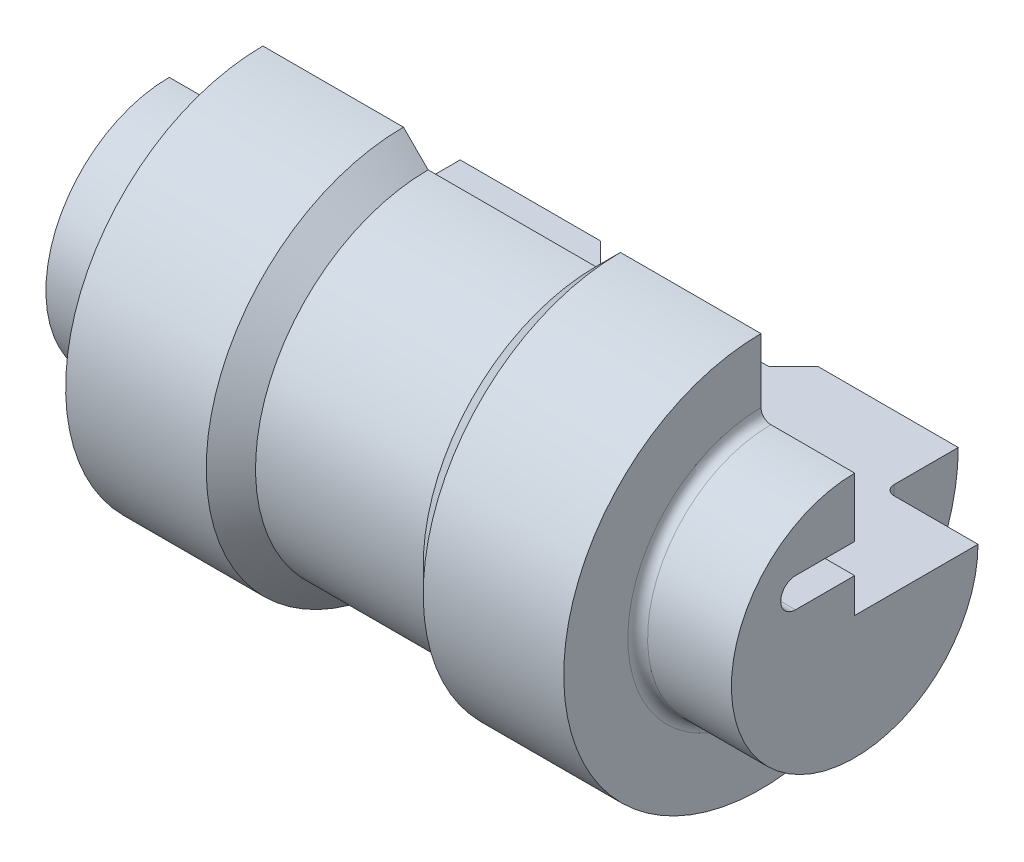
ISO-10303-21;
HEADER;
FILE_DESCRIPTION(('STEP AP214'),'2;1');
FILE_NAME('part.step','',(''),(''),'','','');
FILE_SCHEMA(('AUTOMOTIVE_DESIGN { 1 0 10303 214 1 1 1 1 }'));
ENDSEC;
DATA;
#1=APPLICATION_CONTEXT('core data for automotive mechanical design processes');
#2=APPLICATION_PROTOCOL_DEFINITION('international standard','automotive_design',2000,#1);
#3=PRODUCT_CONTEXT('',#1,'mechanical');
#4=PRODUCT('Part','Part','',(#3));
#5=PRODUCT_RELATED_PRODUCT_CATEGORY('part','',(#4));
#6=PRODUCT_DEFINITION_FORMATION('','',#4);
#7=PRODUCT_DEFINITION_CONTEXT('part definition',#1,'design');
#8=PRODUCT_DEFINITION('design','',#6,#7);
#9=PRODUCT_DEFINITION_SHAPE('','',#8);
#10=(LENGTH_UNIT() NAMED_UNIT(*) SI_UNIT(.MILLI.,.METRE.));
#11=(NAMED_UNIT(*) PLANE_ANGLE_UNIT() SI_UNIT($,.RADIAN.));
#12=(NAMED_UNIT(*) SI_UNIT($,.STERADIAN.) SOLID_ANGLE_UNIT());
#13=UNCERTAINTY_MEASURE_WITH_UNIT(LENGTH_MEASURE(1.E-05),#10,'distance_accuracy_value','');
#14=(GEOMETRIC_REPRESENTATION_CONTEXT(3) GLOBAL_UNCERTAINTY_ASSIGNED_CONTEXT((#13)) GLOBAL_UNIT_ASSIGNED_CONTEXT((#10,
#11,#12)) REPRESENTATION_CONTEXT('',''));
#15=CARTESIAN_POINT('',(0.,0.,0.));
#16=DIRECTION('',(0.,0.,1.));
#17=DIRECTION('',(1.,0.,0.));
#18=AXIS2_PLACEMENT_3D('',#15,#16,#17);
#19=CARTESIAN_POINT('',(122.,27.,0.));
#20=DIRECTION('',(0.,0.,1.));
#21=DIRECTION('',(1.,0.,0.));
#22=AXIS2_PLACEMENT_3D('',#19,#20,#21);
#23=PLANE('',#22);
#24=DIRECTION('',(0.,-1.,0.));
#25=VECTOR('',#24,1.);
#26=CARTESIAN_POINT('',(0.,25.,0.));
#27=LINE('',#26,#25);
#28=CARTESIAN_POINT('',(0.,7.,0.));
#29=VERTEX_POINT('',#28);
#30=CARTESIAN_POINT('',(0.,0.,0.));
#31=VERTEX_POINT('',#30);
#32=EDGE_CURVE('E192',#29,#31,#27,.T.);
#33=ORIENTED_EDGE('',*,*,#32,.F.);
#34=DIRECTION('',(1.,0.,0.));
#35=VECTOR('',#34,1.);
#36=CARTESIAN_POINT('',(0.,7.,0.));
#37=LINE('',#36,#35);
#38=CARTESIAN_POINT('',(139.,7.,0.));
#39=VERTEX_POINT('',#38);
#40=EDGE_CURVE('E189',#29,#39,#37,.T.);
#41=ORIENTED_EDGE('',*,*,#40,.T.);
#42=DIRECTION('',(0.,1.,0.));
#43=VECTOR('',#42,1.);
#44=CARTESIAN_POINT('',(139.,0.,0.));
#45=LINE('',#44,#43);
#46=CARTESIAN_POINT('',(139.,0.,0.));
#47=VERTEX_POINT('',#46);
#48=EDGE_CURVE('E197',#47,#39,#45,.T.);
#49=ORIENTED_EDGE('',*,*,#48,.F.);
#50=DIRECTION('',(1.,0.,0.));
#51=VECTOR('',#50,1.);
#52=CARTESIAN_POINT('',(0.,0.,0.));
#53=LINE('',#52,#51);
#54=EDGE_CURVE('E235',#31,#47,#53,.T.);
#55=ORIENTED_EDGE('',*,*,#54,.F.);
#56=EDGE_LOOP('',(#33,#41,#49,#55));
#57=FACE_BOUND('',#56,.T.);
#58=ADVANCED_FACE('F40',(#57),#23,.F.);
#59=CARTESIAN_POINT('',(0.,2.61861100413235E-13,-25.));
#60=DIRECTION('',(1.,0.,0.));
#61=DIRECTION('',(0.,0.,-1.));
#62=AXIS2_PLACEMENT_3D('',#59,#60,#61);
#63=PLANE('',#62);
#64=CARTESIAN_POINT('',(0.,10.,12.));
#65=DIRECTION('',(1.,0.,0.));
#66=DIRECTION('',(0.,0.,-1.));
#67=AXIS2_PLACEMENT_3D('',#64,#65,#66);
#68=CIRCLE('',#67,3.);
#69=CARTESIAN_POINT('',(0.,13.,12.));
#70=VERTEX_POINT('',#69);
#71=CARTESIAN_POINT('',(0.,7.,12.));
#72=VERTEX_POINT('',#71);
#73=EDGE_CURVE('E170',#70,#72,#68,.T.);
#74=ORIENTED_EDGE('',*,*,#73,.T.);
#75=DIRECTION('',(0.,0.,-1.));
#76=VECTOR('',#75,1.);
#77=CARTESIAN_POINT('',(0.,7.,0.));
#78=LINE('',#77,#76);
#79=EDGE_CURVE('E175',#72,#29,#78,.T.);
#80=ORIENTED_EDGE('',*,*,#79,.T.);
#81=ORIENTED_EDGE('',*,*,#32,.T.);
#82=DIRECTION('',(0.,0.,1.));
#83=VECTOR('',#82,1.);
#84=CARTESIAN_POINT('',(0.,2.61861100413235E-13,-25.));
#85=LINE('',#84,#83);
#86=CARTESIAN_POINT('',(0.,2.61861100413235E-13,-25.));
#87=VERTEX_POINT('',#86);
#88=EDGE_CURVE('E232',#87,#31,#85,.T.);
#89=ORIENTED_EDGE('',*,*,#88,.F.);
#90=CARTESIAN_POINT('',(0.,0.,0.));
#91=DIRECTION('',(-1.,0.,0.));
#92=DIRECTION('',(0.,0.,1.));
#93=AXIS2_PLACEMENT_3D('',#90,#91,#92);
#94=CIRCLE('',#93,25.);
#95=CARTESIAN_POINT('',(0.,25.,0.));
#96=VERTEX_POINT('',#95);
#97=EDGE_CURVE('E63',#87,#96,#94,.T.);
#98=ORIENTED_EDGE('',*,*,#97,.T.);
#99=CARTESIAN_POINT('',(0.,13.,0.));
#100=VERTEX_POINT('',#99);
#101=EDGE_CURVE('E180',#96,#100,#27,.T.);
#102=ORIENTED_EDGE('',*,*,#101,.T.);
#103=DIRECTION('',(0.,0.,1.));
#104=VECTOR('',#103,1.);
#105=CARTESIAN_POINT('',(0.,13.,0.));
#106=LINE('',#105,#104);
#107=EDGE_CURVE('E55',#100,#70,#106,.T.);
#108=ORIENTED_EDGE('',*,*,#107,.T.);
#109=EDGE_LOOP('',(#74,#80,#81,#89,#98,#102,#108));
#110=FACE_BOUND('',#109,.T.);
#111=ADVANCED_FACE('F178',(#110),#63,.F.);
#112=CARTESIAN_POINT('',(139.,0.,0.));
#113=DIRECTION('',(-1.,0.,0.));
#114=DIRECTION('',(0.,0.,1.));
#115=AXIS2_PLACEMENT_3D('',#112,#113,#114);
#116=PLANE('',#115);
#117=ORIENTED_EDGE('',*,*,#48,.T.);
#118=DIRECTION('',(0.,0.,-1.));
#119=VECTOR('',#118,1.);
#120=CARTESIAN_POINT('',(139.,7.,0.));
#121=LINE('',#120,#119);
#122=CARTESIAN_POINT('',(139.,7.,12.));
#123=VERTEX_POINT('',#122);
#124=EDGE_CURVE('E181',#123,#39,#121,.T.);
#125=ORIENTED_EDGE('',*,*,#124,.F.);
#126=CARTESIAN_POINT('',(139.,10.,12.));
#127=DIRECTION('',(1.,0.,0.));
#128=DIRECTION('',(0.,0.,-1.));
#129=AXIS2_PLACEMENT_3D('',#126,#127,#128);
#130=CIRCLE('',#129,3.);
#131=CARTESIAN_POINT('',(139.,13.,12.));
#132=VERTEX_POINT('',#131);
#133=EDGE_CURVE('E183',#132,#123,#130,.T.);
#134=ORIENTED_EDGE('',*,*,#133,.F.);
#135=DIRECTION('',(0.,0.,1.));
#136=VECTOR('',#135,1.);
#137=CARTESIAN_POINT('',(139.,13.,0.));
#138=LINE('',#137,#136);
#139=CARTESIAN_POINT('',(139.,13.,0.));
#140=VERTEX_POINT('',#139);
#141=EDGE_CURVE('E162',#140,#132,#138,.T.);
#142=ORIENTED_EDGE('',*,*,#141,.F.);
#143=CARTESIAN_POINT('',(139.,25.,0.));
#144=VERTEX_POINT('',#143);
#145=EDGE_CURVE('E196',#140,#144,#45,.T.);
#146=ORIENTED_EDGE('',*,*,#145,.T.);
#147=CARTESIAN_POINT('',(139.,0.,0.));
#148=DIRECTION('',(-1.,0.,0.));
#149=DIRECTION('',(0.,0.,1.));
#150=AXIS2_PLACEMENT_3D('',#147,#148,#149);
#151=CIRCLE('',#150,25.);
#152=CARTESIAN_POINT('',(139.,2.61861100413235E-13,-25.));
#153=VERTEX_POINT('',#152);
#154=EDGE_CURVE('E11',#153,#144,#151,.T.);
#155=ORIENTED_EDGE('',*,*,#154,.F.);
#156=DIRECTION('',(0.,0.,-1.));
#157=VECTOR('',#156,1.);
#158=CARTESIAN_POINT('',(139.,0.,0.));
#159=LINE('',#158,#157);
#160=EDGE_CURVE('E238',#47,#153,#159,.T.);
#161=ORIENTED_EDGE('',*,*,#160,.F.);
#162=EDGE_LOOP('',(#117,#125,#134,#142,#146,#155,#161));
#163=FACE_BOUND('',#162,.T.);
#164=ADVANCED_FACE('F42',(#163),#116,.F.);
#165=CARTESIAN_POINT('',(0.,0.,0.));
#166=DIRECTION('',(-1.,0.,0.));
#167=DIRECTION('',(0.,0.,1.));
#168=AXIS2_PLACEMENT_3D('',#165,#166,#167);
#169=CYLINDRICAL_SURFACE('',#168,25.);
#170=CARTESIAN_POINT('',(122.,0.,0.));
#171=DIRECTION('',(-1.,0.,0.));
#172=DIRECTION('',(0.,0.,1.));
#173=AXIS2_PLACEMENT_3D('',#170,#171,#172);
#174=CIRCLE('',#173,25.);
#175=CARTESIAN_POINT('',(122.,2.61861100413235E-13,-25.));
#176=VERTEX_POINT('',#175);
#177=CARTESIAN_POINT('',(122.,25.,0.));
#178=VERTEX_POINT('',#177);
#179=EDGE_CURVE('E48',#176,#178,#174,.T.);
#180=ORIENTED_EDGE('',*,*,#179,.F.);
#181=DIRECTION('',(-1.,0.,0.));
#182=VECTOR('',#181,1.);
#183=CARTESIAN_POINT('',(139.,2.61861100413235E-13,-25.));
#184=LINE('',#183,#182);
#185=EDGE_CURVE('E241',#153,#176,#184,.T.);
#186=ORIENTED_EDGE('',*,*,#185,.F.);
#187=ORIENTED_EDGE('',*,*,#154,.T.);
#188=DIRECTION('',(-1.,0.,0.));
#189=VECTOR('',#188,1.);
#190=CARTESIAN_POINT('',(139.,25.,0.));
#191=LINE('',#190,#189);
#192=EDGE_CURVE('E200',#144,#178,#191,.T.);
#193=ORIENTED_EDGE('',*,*,#192,.T.);
#194=EDGE_LOOP('',(#180,#186,#187,#193));
#195=FACE_BOUND('',#194,.T.);
#196=ADVANCED_FACE('F300',(#195),#169,.T.);
#197=CARTESIAN_POINT('',(122.,0.,0.));
#198=DIRECTION('',(-1.,0.,0.));
#199=DIRECTION('',(0.,0.,1.));
#200=AXIS2_PLACEMENT_3D('',#197,#198,#199);
#201=TOROIDAL_SURFACE('',#200,27.,2.);
#202=CARTESIAN_POINT('',(120.,0.,0.));
#203=DIRECTION('',(-1.,0.,0.));
#204=DIRECTION('',(0.,0.,1.));
#205=AXIS2_PLACEMENT_3D('',#202,#203,#204);
#206=CIRCLE('',#205,27.);
#207=CARTESIAN_POINT('',(120.,2.82809988446294E-13,-27.));
#208=VERTEX_POINT('',#207);
#209=CARTESIAN_POINT('',(120.,27.,0.));
#210=VERTEX_POINT('',#209);
#211=EDGE_CURVE('E291',#208,#210,#206,.T.);
#212=ORIENTED_EDGE('',*,*,#211,.F.);
#213=CARTESIAN_POINT('',(122.,2.82809988446294E-13,-27.));
#214=DIRECTION('',(0.,-1.,0.));
#215=DIRECTION('',(1.,0.,0.));
#216=AXIS2_PLACEMENT_3D('',#213,#214,#215);
#217=CIRCLE('',#216,2.);
#218=EDGE_CURVE('E244',#176,#208,#217,.T.);
#219=ORIENTED_EDGE('',*,*,#218,.F.);
#220=ORIENTED_EDGE('',*,*,#179,.T.);
#221=CARTESIAN_POINT('',(122.,27.,0.));
#222=DIRECTION('',(0.,0.,-1.));
#223=DIRECTION('',(1.,0.,0.));
#224=AXIS2_PLACEMENT_3D('',#221,#222,#223);
#225=CIRCLE('',#224,2.);
#226=EDGE_CURVE('E203',#178,#210,#225,.T.);
#227=ORIENTED_EDGE('',*,*,#226,.T.);
#228=EDGE_LOOP('',(#212,#219,#220,#227));
#229=FACE_BOUND('',#228,.T.);
#230=ADVANCED_FACE('F294',(#229),#201,.F.);
#231=CARTESIAN_POINT('',(120.,2.82809988446294E-13,-27.));
#232=DIRECTION('',(-1.,0.,0.));
#233=DIRECTION('',(0.,0.,1.));
#234=AXIS2_PLACEMENT_3D('',#231,#232,#233);
#235=PLANE('',#234);
#236=CARTESIAN_POINT('',(120.,0.,0.));
#237=DIRECTION('',(-1.,0.,0.));
#238=DIRECTION('',(0.,0.,1.));
#239=AXIS2_PLACEMENT_3D('',#236,#237,#238);
#240=CIRCLE('',#239,40.);
#241=CARTESIAN_POINT('',(120.,4.18977760661176E-13,-40.));
#242=VERTEX_POINT('',#241);
#243=CARTESIAN_POINT('',(120.,40.,0.));
#244=VERTEX_POINT('',#243);
#245=EDGE_CURVE('E289',#242,#244,#240,.T.);
#246=ORIENTED_EDGE('',*,*,#245,.F.);
#247=DIRECTION('',(0.,0.,-1.));
#248=VECTOR('',#247,1.);
#249=CARTESIAN_POINT('',(120.,2.82809988446294E-13,-27.));
#250=LINE('',#249,#248);
#251=EDGE_CURVE('E247',#208,#242,#250,.T.);
#252=ORIENTED_EDGE('',*,*,#251,.F.);
#253=ORIENTED_EDGE('',*,*,#211,.T.);
#254=DIRECTION('',(0.,1.,0.));
#255=VECTOR('',#254,1.);
#256=CARTESIAN_POINT('',(120.,27.,0.));
#257=LINE('',#256,#255);
#258=EDGE_CURVE('E206',#210,#244,#257,.T.);
#259=ORIENTED_EDGE('',*,*,#258,.T.);
#260=EDGE_LOOP('',(#246,#252,#253,#259));
#261=FACE_BOUND('',#260,.T.);
#262=ADVANCED_FACE('F307',(#261),#235,.F.);
#263=CARTESIAN_POINT('',(0.,0.,0.));
#264=DIRECTION('',(-1.,0.,0.));
#265=DIRECTION('',(0.,0.,1.));
#266=AXIS2_PLACEMENT_3D('',#263,#264,#265);
#267=CYLINDRICAL_SURFACE('',#266,40.);
#268=CARTESIAN_POINT('',(91.5,0.,0.));
#269=DIRECTION('',(-1.,0.,0.));
#270=DIRECTION('',(0.,0.,1.));
#271=AXIS2_PLACEMENT_3D('',#268,#269,#270);
#272=CIRCLE('',#271,40.);
#273=CARTESIAN_POINT('',(91.5,4.18977760661176E-13,-40.));
#274=VERTEX_POINT('',#273);
#275=CARTESIAN_POINT('',(91.5,40.,0.));
#276=VERTEX_POINT('',#275);
#277=EDGE_CURVE('E287',#274,#276,#272,.T.);
#278=ORIENTED_EDGE('',*,*,#277,.F.);
#279=DIRECTION('',(-1.,0.,0.));
#280=VECTOR('',#279,1.);
#281=CARTESIAN_POINT('',(120.,4.18977760661176E-13,-40.));
#282=LINE('',#281,#280);
#283=EDGE_CURVE('E250',#242,#274,#282,.T.);
#284=ORIENTED_EDGE('',*,*,#283,.F.);
#285=ORIENTED_EDGE('',*,*,#245,.T.);
#286=DIRECTION('',(-1.,0.,0.));
#287=VECTOR('',#286,1.);
#288=CARTESIAN_POINT('',(120.,40.,0.));
#289=LINE('',#288,#287);
#290=EDGE_CURVE('E209',#244,#276,#289,.T.);
#291=ORIENTED_EDGE('',*,*,#290,.T.);
#292=EDGE_LOOP('',(#278,#284,#285,#291));
#293=FACE_BOUND('',#292,.T.);
#294=ADVANCED_FACE('F342',(#293),#267,.T.);
#295=CARTESIAN_POINT('',(91.5,0.,0.));
#296=DIRECTION('',(1.,0.,0.));
#297=DIRECTION('',(0.,0.,-1.));
#298=AXIS2_PLACEMENT_3D('',#295,#296,#297);
#299=CONICAL_SURFACE('',#298,40.,0.78539816339745);
#300=CARTESIAN_POINT('',(86.5,0.,0.));
#301=DIRECTION('',(-1.,0.,0.));
#302=DIRECTION('',(0.,0.,1.));
#303=AXIS2_PLACEMENT_3D('',#300,#301,#302);
#304=CIRCLE('',#303,35.);
#305=CARTESIAN_POINT('',(86.5,3.66605540578529E-13,-35.));
#306=VERTEX_POINT('',#305);
#307=CARTESIAN_POINT('',(86.5,35.,0.));
#308=VERTEX_POINT('',#307);
#309=EDGE_CURVE('E285',#306,#308,#304,.T.);
#310=ORIENTED_EDGE('',*,*,#309,.F.);
#311=DIRECTION('',(-0.707106781186547,0.,0.707106781186549));
#312=VECTOR('',#311,1.);
#313=CARTESIAN_POINT('',(91.5,4.18977760661176E-13,-40.));
#314=LINE('',#313,#312);
#315=EDGE_CURVE('E253',#274,#306,#314,.T.);
#316=ORIENTED_EDGE('',*,*,#315,.F.);
#317=ORIENTED_EDGE('',*,*,#277,.T.);
#318=DIRECTION('',(-0.707106781186547,-0.707106781186549,0.));
#319=VECTOR('',#318,1.);
#320=CARTESIAN_POINT('',(91.5,40.,0.));
#321=LINE('',#320,#319);
#322=EDGE_CURVE('E212',#276,#308,#321,.T.);
#323=ORIENTED_EDGE('',*,*,#322,.T.);
#324=EDGE_LOOP('',(#310,#316,#317,#323));
#325=FACE_BOUND('',#324,.T.);
#326=ADVANCED_FACE('F340',(#325),#299,.T.);
#327=CARTESIAN_POINT('',(0.,0.,0.));
#328=DIRECTION('',(-1.,0.,0.));
#329=DIRECTION('',(0.,0.,1.));
#330=AXIS2_PLACEMENT_3D('',#327,#328,#329);
#331=CYLINDRICAL_SURFACE('',#330,35.);
#332=CARTESIAN_POINT('',(52.5,0.,0.));
#333=DIRECTION('',(-1.,0.,0.));
#334=DIRECTION('',(0.,0.,1.));
#335=AXIS2_PLACEMENT_3D('',#332,#333,#334);
#336=CIRCLE('',#335,35.);
#337=CARTESIAN_POINT('',(52.5,3.66605540578529E-13,-35.));
#338=VERTEX_POINT('',#337);
#339=CARTESIAN_POINT('',(52.5,35.,0.));
#340=VERTEX_POINT('',#339);
#341=EDGE_CURVE('E283',#338,#340,#336,.T.);
#342=ORIENTED_EDGE('',*,*,#341,.F.);
#343=DIRECTION('',(-1.,0.,0.));
#344=VECTOR('',#343,1.);
#345=CARTESIAN_POINT('',(86.5,3.66605540578529E-13,-35.));
#346=LINE('',#345,#344);
#347=EDGE_CURVE('E256',#306,#338,#346,.T.);
#348=ORIENTED_EDGE('',*,*,#347,.F.);
#349=ORIENTED_EDGE('',*,*,#309,.T.);
#350=DIRECTION('',(-1.,0.,0.));
#351=VECTOR('',#350,1.);
#352=CARTESIAN_POINT('',(86.5,35.,0.));
#353=LINE('',#352,#351);
#354=EDGE_CURVE('E215',#308,#340,#353,.T.);
#355=ORIENTED_EDGE('',*,*,#354,.T.);
#356=EDGE_LOOP('',(#342,#348,#349,#355));
#357=FACE_BOUND('',#356,.T.);
#358=ADVANCED_FACE('F336',(#357),#331,.T.);
#359=CARTESIAN_POINT('',(52.5,0.,0.));
#360=DIRECTION('',(-1.,0.,0.));
#361=DIRECTION('',(0.,0.,1.));
#362=AXIS2_PLACEMENT_3D('',#359,#360,#361);
#363=CONICAL_SURFACE('',#362,35.,0.785398163397448);
#364=CARTESIAN_POINT('',(47.5,0.,0.));
#365=DIRECTION('',(-1.,0.,0.));
#366=DIRECTION('',(0.,0.,1.));
#367=AXIS2_PLACEMENT_3D('',#364,#365,#366);
#368=CIRCLE('',#367,40.);
#369=CARTESIAN_POINT('',(47.5,4.18977760661176E-13,-40.));
#370=VERTEX_POINT('',#369);
#371=CARTESIAN_POINT('',(47.5,40.,0.));
#372=VERTEX_POINT('',#371);
#373=EDGE_CURVE('E281',#370,#372,#368,.T.);
#374=ORIENTED_EDGE('',*,*,#373,.F.);
#375=DIRECTION('',(-0.707106781186547,0.,-0.707106781186547));
#376=VECTOR('',#375,1.);
#377=CARTESIAN_POINT('',(52.5,3.66605540578529E-13,-35.));
#378=LINE('',#377,#376);
#379=EDGE_CURVE('E259',#338,#370,#378,.T.);
#380=ORIENTED_EDGE('',*,*,#379,.F.);
#381=ORIENTED_EDGE('',*,*,#341,.T.);
#382=DIRECTION('',(-0.707106781186547,0.707106781186547,0.));
#383=VECTOR('',#382,1.);
#384=CARTESIAN_POINT('',(52.5,35.,0.));
#385=LINE('',#384,#383);
#386=EDGE_CURVE('E218',#340,#372,#385,.T.);
#387=ORIENTED_EDGE('',*,*,#386,.T.);
#388=EDGE_LOOP('',(#374,#380,#381,#387));
#389=FACE_BOUND('',#388,.T.);
#390=ADVANCED_FACE('F333',(#389),#363,.T.);
#391=CARTESIAN_POINT('',(0.,0.,0.));
#392=DIRECTION('',(-1.,0.,0.));
#393=DIRECTION('',(0.,0.,1.));
#394=AXIS2_PLACEMENT_3D('',#391,#392,#393);
#395=CYLINDRICAL_SURFACE('',#394,40.);
#396=CARTESIAN_POINT('',(19.,0.,0.));
#397=DIRECTION('',(-1.,0.,0.));
#398=DIRECTION('',(0.,0.,1.));
#399=AXIS2_PLACEMENT_3D('',#396,#397,#398);
#400=CIRCLE('',#399,40.);
#401=CARTESIAN_POINT('',(19.,4.18977760661176E-13,-40.));
#402=VERTEX_POINT('',#401);
#403=CARTESIAN_POINT('',(19.,40.,0.));
#404=VERTEX_POINT('',#403);
#405=EDGE_CURVE('E279',#402,#404,#400,.T.);
#406=ORIENTED_EDGE('',*,*,#405,.F.);
#407=DIRECTION('',(-1.,0.,0.));
#408=VECTOR('',#407,1.);
#409=CARTESIAN_POINT('',(47.5,4.18977760661176E-13,-40.));
#410=LINE('',#409,#408);
#411=EDGE_CURVE('E262',#370,#402,#410,.T.);
#412=ORIENTED_EDGE('',*,*,#411,.F.);
#413=ORIENTED_EDGE('',*,*,#373,.T.);
#414=DIRECTION('',(-1.,0.,0.));
#415=VECTOR('',#414,1.);
#416=CARTESIAN_POINT('',(47.5,40.,0.));
#417=LINE('',#416,#415);
#418=EDGE_CURVE('E221',#372,#404,#417,.T.);
#419=ORIENTED_EDGE('',*,*,#418,.T.);
#420=EDGE_LOOP('',(#406,#412,#413,#419));
#421=FACE_BOUND('',#420,.T.);
#422=ADVANCED_FACE('F330',(#421),#395,.T.);
#423=CARTESIAN_POINT('',(19.,4.18977760661176E-13,-40.));
#424=DIRECTION('',(1.,0.,0.));
#425=DIRECTION('',(0.,0.,-1.));
#426=AXIS2_PLACEMENT_3D('',#423,#424,#425);
#427=PLANE('',#426);
#428=CARTESIAN_POINT('',(19.,0.,0.));
#429=DIRECTION('',(-1.,0.,0.));
#430=DIRECTION('',(0.,0.,1.));
#431=AXIS2_PLACEMENT_3D('',#428,#429,#430);
#432=CIRCLE('',#431,27.);
#433=CARTESIAN_POINT('',(19.,2.82809988446294E-13,-27.));
#434=VERTEX_POINT('',#433);
#435=CARTESIAN_POINT('',(19.,27.,0.));
#436=VERTEX_POINT('',#435);
#437=EDGE_CURVE('E277',#434,#436,#432,.T.);
#438=ORIENTED_EDGE('',*,*,#437,.F.);
#439=DIRECTION('',(0.,0.,1.));
#440=VECTOR('',#439,1.);
#441=CARTESIAN_POINT('',(19.,4.18977760661176E-13,-40.));
#442=LINE('',#441,#440);
#443=EDGE_CURVE('E265',#402,#434,#442,.T.);
#444=ORIENTED_EDGE('',*,*,#443,.F.);
#445=ORIENTED_EDGE('',*,*,#405,.T.);
#446=DIRECTION('',(0.,-1.,0.));
#447=VECTOR('',#446,1.);
#448=CARTESIAN_POINT('',(19.,40.,0.));
#449=LINE('',#448,#447);
#450=EDGE_CURVE('E224',#404,#436,#449,.T.);
#451=ORIENTED_EDGE('',*,*,#450,.T.);
#452=EDGE_LOOP('',(#438,#444,#445,#451));
#453=FACE_BOUND('',#452,.T.);
#454=ADVANCED_FACE('F326',(#453),#427,.F.);
#455=CARTESIAN_POINT('',(17.,0.,0.));
#456=DIRECTION('',(-1.,0.,0.));
#457=DIRECTION('',(0.,0.,1.));
#458=AXIS2_PLACEMENT_3D('',#455,#456,#457);
#459=TOROIDAL_SURFACE('',#458,27.,2.);
#460=CARTESIAN_POINT('',(17.,0.,0.));
#461=DIRECTION('',(-1.,0.,0.));
#462=DIRECTION('',(0.,0.,1.));
#463=AXIS2_PLACEMENT_3D('',#460,#461,#462);
#464=CIRCLE('',#463,25.);
#465=CARTESIAN_POINT('',(17.,2.61861100413235E-13,-25.));
#466=VERTEX_POINT('',#465);
#467=CARTESIAN_POINT('',(17.,25.,0.));
#468=VERTEX_POINT('',#467);
#469=EDGE_CURVE('E275',#466,#468,#464,.T.);
#470=ORIENTED_EDGE('',*,*,#469,.F.);
#471=CARTESIAN_POINT('',(17.,2.82809988446294E-13,-27.));
#472=DIRECTION('',(0.,-1.,0.));
#473=DIRECTION('',(-1.,0.,0.));
#474=AXIS2_PLACEMENT_3D('',#471,#472,#473);
#475=CIRCLE('',#474,2.);
#476=EDGE_CURVE('E268',#434,#466,#475,.T.);
#477=ORIENTED_EDGE('',*,*,#476,.F.);
#478=ORIENTED_EDGE('',*,*,#437,.T.);
#479=CARTESIAN_POINT('',(17.,27.,0.));
#480=DIRECTION('',(0.,0.,-1.));
#481=DIRECTION('',(-1.,0.,0.));
#482=AXIS2_PLACEMENT_3D('',#479,#480,#481);
#483=CIRCLE('',#482,2.);
#484=EDGE_CURVE('E227',#436,#468,#483,.T.);
#485=ORIENTED_EDGE('',*,*,#484,.T.);
#486=EDGE_LOOP('',(#470,#477,#478,#485));
#487=FACE_BOUND('',#486,.T.);
#488=ADVANCED_FACE('F321',(#487),#459,.F.);
#489=CARTESIAN_POINT('',(0.,0.,0.));
#490=DIRECTION('',(-1.,0.,0.));
#491=DIRECTION('',(0.,0.,1.));
#492=AXIS2_PLACEMENT_3D('',#489,#490,#491);
#493=CYLINDRICAL_SURFACE('',#492,25.);
#494=DIRECTION('',(-1.,0.,0.));
#495=VECTOR('',#494,1.);
#496=CARTESIAN_POINT('',(17.,2.61861100413235E-13,-25.));
#497=LINE('',#496,#495);
#498=EDGE_CURVE('E271',#466,#87,#497,.T.);
#499=ORIENTED_EDGE('',*,*,#498,.F.);
#500=ORIENTED_EDGE('',*,*,#469,.T.);
#501=DIRECTION('',(-1.,0.,0.));
#502=VECTOR('',#501,1.);
#503=CARTESIAN_POINT('',(17.,25.,0.));
#504=LINE('',#503,#502);
#505=EDGE_CURVE('E230',#468,#96,#504,.T.);
#506=ORIENTED_EDGE('',*,*,#505,.T.);
#507=ORIENTED_EDGE('',*,*,#97,.F.);
#508=EDGE_LOOP('',(#499,#500,#506,#507));
#509=FACE_BOUND('',#508,.T.);
#510=ADVANCED_FACE('F318',(#509),#493,.T.);
#511=CARTESIAN_POINT('',(122.,2.82809988446294E-13,-27.));
#512=DIRECTION('',(0.,1.,0.));
#513=DIRECTION('',(1.,0.,0.));
#514=AXIS2_PLACEMENT_3D('',#511,#512,#513);
#515=PLANE('',#514);
#516=ORIENTED_EDGE('',*,*,#88,.T.);
#517=ORIENTED_EDGE('',*,*,#54,.T.);
#518=ORIENTED_EDGE('',*,*,#160,.T.);
#519=ORIENTED_EDGE('',*,*,#185,.T.);
#520=ORIENTED_EDGE('',*,*,#218,.T.);
#521=ORIENTED_EDGE('',*,*,#251,.T.);
#522=ORIENTED_EDGE('',*,*,#283,.T.);
#523=ORIENTED_EDGE('',*,*,#315,.T.);
#524=ORIENTED_EDGE('',*,*,#347,.T.);
#525=ORIENTED_EDGE('',*,*,#379,.T.);
#526=ORIENTED_EDGE('',*,*,#411,.T.);
#527=ORIENTED_EDGE('',*,*,#443,.T.);
#528=ORIENTED_EDGE('',*,*,#476,.T.);
#529=ORIENTED_EDGE('',*,*,#498,.T.);
#530=EDGE_LOOP('',(#516,#517,#518,#519,#520,#521,#522,#523,#524,#525,#526,#527,#528,#529));
#531=FACE_BOUND('',#530,.T.);
#532=ADVANCED_FACE('F310',(#531),#515,.T.);
#533=ORIENTED_EDGE('',*,*,#145,.F.);
#534=DIRECTION('',(1.,0.,0.));
#535=VECTOR('',#534,1.);
#536=CARTESIAN_POINT('',(0.,13.,0.));
#537=LINE('',#536,#535);
#538=EDGE_CURVE('E167',#100,#140,#537,.T.);
#539=ORIENTED_EDGE('',*,*,#538,.F.);
#540=ORIENTED_EDGE('',*,*,#101,.F.);
#541=ORIENTED_EDGE('',*,*,#505,.F.);
#542=ORIENTED_EDGE('',*,*,#484,.F.);
#543=ORIENTED_EDGE('',*,*,#450,.F.);
#544=ORIENTED_EDGE('',*,*,#418,.F.);
#545=ORIENTED_EDGE('',*,*,#386,.F.);
#546=ORIENTED_EDGE('',*,*,#354,.F.);
#547=ORIENTED_EDGE('',*,*,#322,.F.);
#548=ORIENTED_EDGE('',*,*,#290,.F.);
#549=ORIENTED_EDGE('',*,*,#258,.F.);
#550=ORIENTED_EDGE('',*,*,#226,.F.);
#551=ORIENTED_EDGE('',*,*,#192,.F.);
#552=EDGE_LOOP('',(#533,#539,#540,#541,#542,#543,#544,#545,#546,#547,#548,#549,#550,#551));
#553=FACE_BOUND('',#552,.T.);
#554=ADVANCED_FACE('F303',(#553),#23,.F.);
#555=CARTESIAN_POINT('',(0.,7.,0.));
#556=DIRECTION('',(0.,-1.,0.));
#557=DIRECTION('',(0.,0.,-1.));
#558=AXIS2_PLACEMENT_3D('',#555,#556,#557);
#559=PLANE('',#558);
#560=ORIENTED_EDGE('',*,*,#124,.T.);
#561=ORIENTED_EDGE('',*,*,#40,.F.);
#562=ORIENTED_EDGE('',*,*,#79,.F.);
#563=DIRECTION('',(1.,0.,0.));
#564=VECTOR('',#563,1.);
#565=CARTESIAN_POINT('',(0.,7.,12.));
#566=LINE('',#565,#564);
#567=EDGE_CURVE('E166',#72,#123,#566,.T.);
#568=ORIENTED_EDGE('',*,*,#567,.T.);
#569=EDGE_LOOP('',(#560,#561,#562,#568));
#570=FACE_BOUND('',#569,.T.);
#571=ADVANCED_FACE('F346',(#570),#559,.F.);
#572=CARTESIAN_POINT('',(0.,10.,12.));
#573=DIRECTION('',(1.,0.,0.));
#574=DIRECTION('',(0.,0.,-1.));
#575=AXIS2_PLACEMENT_3D('',#572,#573,#574);
#576=CYLINDRICAL_SURFACE('',#575,3.);
#577=ORIENTED_EDGE('',*,*,#133,.T.);
#578=ORIENTED_EDGE('',*,*,#567,.F.);
#579=ORIENTED_EDGE('',*,*,#73,.F.);
#580=DIRECTION('',(1.,0.,0.));
#581=VECTOR('',#580,1.);
#582=CARTESIAN_POINT('',(0.,13.,12.));
#583=LINE('',#582,#581);
#584=EDGE_CURVE('E158',#70,#132,#583,.T.);
#585=ORIENTED_EDGE('',*,*,#584,.T.);
#586=EDGE_LOOP('',(#577,#578,#579,#585));
#587=FACE_BOUND('',#586,.T.);
#588=ADVANCED_FACE('F171',(#587),#576,.F.);
#589=CARTESIAN_POINT('',(0.,13.,0.));
#590=DIRECTION('',(0.,1.,0.));
#591=DIRECTION('',(0.,0.,1.));
#592=AXIS2_PLACEMENT_3D('',#589,#590,#591);
#593=PLANE('',#592);
#594=ORIENTED_EDGE('',*,*,#141,.T.);
#595=ORIENTED_EDGE('',*,*,#584,.F.);
#596=ORIENTED_EDGE('',*,*,#107,.F.);
#597=ORIENTED_EDGE('',*,*,#538,.T.);
#598=EDGE_LOOP('',(#594,#595,#596,#597));
#599=FACE_BOUND('',#598,.T.);
#600=ADVANCED_FACE('F160',(#599),#593,.F.);
#601=CLOSED_SHELL('',(#58,#111,#164,#196,#230,#262,#294,#326,#358,#390,#422,#454,#488,#510,#532,
#554,#571,#588,#600));
#602=MANIFOLD_SOLID_BREP('B2',#601);
#603=ADVANCED_BREP_SHAPE_REPRESENTATION('',(#18,#602),#14);
#604=SHAPE_DEFINITION_REPRESENTATION(#9,#603);
ENDSEC;
END-ISO-10303-21;
